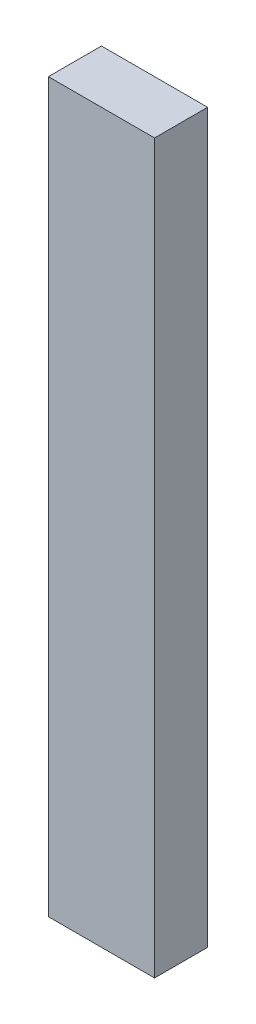
ISO-10303-21;
HEADER;
FILE_DESCRIPTION(('STEP AP214'),'2;1');
FILE_NAME('part.step','',(''),(''),'','','');
FILE_SCHEMA(('AUTOMOTIVE_DESIGN { 1 0 10303 214 1 1 1 1 }'));
ENDSEC;
DATA;
#1=APPLICATION_CONTEXT('core data for automotive mechanical design processes');
#2=APPLICATION_PROTOCOL_DEFINITION('international standard','automotive_design',2000,#1);
#3=PRODUCT_CONTEXT('',#1,'mechanical');
#4=PRODUCT('Part','Part','',(#3));
#5=PRODUCT_RELATED_PRODUCT_CATEGORY('part','',(#4));
#6=PRODUCT_DEFINITION_FORMATION('','',#4);
#7=PRODUCT_DEFINITION_CONTEXT('part definition',#1,'design');
#8=PRODUCT_DEFINITION('design','',#6,#7);
#9=PRODUCT_DEFINITION_SHAPE('','',#8);
#10=(LENGTH_UNIT() NAMED_UNIT(*) SI_UNIT(.MILLI.,.METRE.));
#11=(NAMED_UNIT(*) PLANE_ANGLE_UNIT() SI_UNIT($,.RADIAN.));
#12=(NAMED_UNIT(*) SI_UNIT($,.STERADIAN.) SOLID_ANGLE_UNIT());
#13=UNCERTAINTY_MEASURE_WITH_UNIT(LENGTH_MEASURE(1.E-05),#10,'distance_accuracy_value','');
#14=(GEOMETRIC_REPRESENTATION_CONTEXT(3) GLOBAL_UNCERTAINTY_ASSIGNED_CONTEXT((#13)) GLOBAL_UNIT_ASSIGNED_CONTEXT((#10,
#11,#12)) REPRESENTATION_CONTEXT('',''));
#15=CARTESIAN_POINT('',(0.,0.,0.));
#16=DIRECTION('',(0.,0.,1.));
#17=DIRECTION('',(1.,0.,0.));
#18=AXIS2_PLACEMENT_3D('',#15,#16,#17);
#19=CARTESIAN_POINT('',(304.8,4178.3,-152.4));
#20=DIRECTION('',(-1.,0.,0.));
#21=DIRECTION('',(0.,0.,1.));
#22=AXIS2_PLACEMENT_3D('',#19,#20,#21);
#23=PLANE('',#22);
#24=DIRECTION('',(0.,0.,-1.));
#25=VECTOR('',#24,1.);
#26=CARTESIAN_POINT('',(304.8,0.,-152.4));
#27=LINE('',#26,#25);
#28=CARTESIAN_POINT('',(304.8,0.,152.4));
#29=VERTEX_POINT('',#28);
#30=CARTESIAN_POINT('',(304.8,0.,-152.4));
#31=VERTEX_POINT('',#30);
#32=EDGE_CURVE('E117',#29,#31,#27,.T.);
#33=ORIENTED_EDGE('',*,*,#32,.T.);
#34=DIRECTION('',(0.,-1.,0.));
#35=VECTOR('',#34,1.);
#36=CARTESIAN_POINT('',(304.8,4178.3,-152.4));
#37=LINE('',#36,#35);
#38=CARTESIAN_POINT('',(304.8,4178.3,-152.4));
#39=VERTEX_POINT('',#38);
#40=EDGE_CURVE('E11',#39,#31,#37,.T.);
#41=ORIENTED_EDGE('',*,*,#40,.F.);
#42=DIRECTION('',(0.,0.,-1.));
#43=VECTOR('',#42,1.);
#44=CARTESIAN_POINT('',(304.8,4178.3,-152.4));
#45=LINE('',#44,#43);
#46=CARTESIAN_POINT('',(304.8,4178.3,152.4));
#47=VERTEX_POINT('',#46);
#48=EDGE_CURVE('E101',#47,#39,#45,.T.);
#49=ORIENTED_EDGE('',*,*,#48,.F.);
#50=DIRECTION('',(0.,-1.,0.));
#51=VECTOR('',#50,1.);
#52=CARTESIAN_POINT('',(304.8,4178.3,152.4));
#53=LINE('',#52,#51);
#54=EDGE_CURVE('E113',#47,#29,#53,.T.);
#55=ORIENTED_EDGE('',*,*,#54,.T.);
#56=EDGE_LOOP('',(#33,#41,#49,#55));
#57=FACE_BOUND('',#56,.T.);
#58=ADVANCED_FACE('F43',(#57),#23,.F.);
#59=CARTESIAN_POINT('',(-304.8,4178.3,-152.4));
#60=DIRECTION('',(0.,0.,1.));
#61=DIRECTION('',(1.,0.,0.));
#62=AXIS2_PLACEMENT_3D('',#59,#60,#61);
#63=PLANE('',#62);
#64=DIRECTION('',(-1.,0.,0.));
#65=VECTOR('',#64,1.);
#66=CARTESIAN_POINT('',(-304.8,0.,-152.4));
#67=LINE('',#66,#65);
#68=CARTESIAN_POINT('',(-304.8,0.,-152.4));
#69=VERTEX_POINT('',#68);
#70=EDGE_CURVE('E106',#31,#69,#67,.T.);
#71=ORIENTED_EDGE('',*,*,#70,.T.);
#72=DIRECTION('',(0.,-1.,0.));
#73=VECTOR('',#72,1.);
#74=CARTESIAN_POINT('',(-304.8,4178.3,-152.4));
#75=LINE('',#74,#73);
#76=CARTESIAN_POINT('',(-304.8,4178.3,-152.4));
#77=VERTEX_POINT('',#76);
#78=EDGE_CURVE('E52',#77,#69,#75,.T.);
#79=ORIENTED_EDGE('',*,*,#78,.F.);
#80=DIRECTION('',(-1.,0.,0.));
#81=VECTOR('',#80,1.);
#82=CARTESIAN_POINT('',(-304.8,4178.3,-152.4));
#83=LINE('',#82,#81);
#84=EDGE_CURVE('E95',#39,#77,#83,.T.);
#85=ORIENTED_EDGE('',*,*,#84,.F.);
#86=ORIENTED_EDGE('',*,*,#40,.T.);
#87=EDGE_LOOP('',(#71,#79,#85,#86));
#88=FACE_BOUND('',#87,.T.);
#89=ADVANCED_FACE('F105',(#88),#63,.F.);
#90=CARTESIAN_POINT('',(-304.8,4178.3,-152.4));
#91=DIRECTION('',(1.,0.,0.));
#92=DIRECTION('',(0.,0.,-1.));
#93=AXIS2_PLACEMENT_3D('',#90,#91,#92);
#94=PLANE('',#93);
#95=DIRECTION('',(0.,0.,1.));
#96=VECTOR('',#95,1.);
#97=CARTESIAN_POINT('',(-304.8,0.,-152.4));
#98=LINE('',#97,#96);
#99=CARTESIAN_POINT('',(-304.8,0.,152.4));
#100=VERTEX_POINT('',#99);
#101=EDGE_CURVE('E82',#69,#100,#98,.T.);
#102=ORIENTED_EDGE('',*,*,#101,.T.);
#103=DIRECTION('',(0.,-1.,0.));
#104=VECTOR('',#103,1.);
#105=CARTESIAN_POINT('',(-304.8,4178.3,152.4));
#106=LINE('',#105,#104);
#107=CARTESIAN_POINT('',(-304.8,4178.3,152.4));
#108=VERTEX_POINT('',#107);
#109=EDGE_CURVE('E108',#108,#100,#106,.T.);
#110=ORIENTED_EDGE('',*,*,#109,.F.);
#111=DIRECTION('',(0.,0.,1.));
#112=VECTOR('',#111,1.);
#113=CARTESIAN_POINT('',(-304.8,4178.3,-152.4));
#114=LINE('',#113,#112);
#115=EDGE_CURVE('E99',#77,#108,#114,.T.);
#116=ORIENTED_EDGE('',*,*,#115,.F.);
#117=ORIENTED_EDGE('',*,*,#78,.T.);
#118=EDGE_LOOP('',(#102,#110,#116,#117));
#119=FACE_BOUND('',#118,.T.);
#120=ADVANCED_FACE('F109',(#119),#94,.F.);
#121=CARTESIAN_POINT('',(-304.8,4178.3,152.4));
#122=DIRECTION('',(0.,0.,-1.));
#123=DIRECTION('',(-1.,0.,0.));
#124=AXIS2_PLACEMENT_3D('',#121,#122,#123);
#125=PLANE('',#124);
#126=DIRECTION('',(1.,0.,0.));
#127=VECTOR('',#126,1.);
#128=CARTESIAN_POINT('',(-304.8,0.,152.4));
#129=LINE('',#128,#127);
#130=EDGE_CURVE('E88',#100,#29,#129,.T.);
#131=ORIENTED_EDGE('',*,*,#130,.T.);
#132=ORIENTED_EDGE('',*,*,#54,.F.);
#133=DIRECTION('',(1.,0.,0.));
#134=VECTOR('',#133,1.);
#135=CARTESIAN_POINT('',(-304.8,4178.3,152.4));
#136=LINE('',#135,#134);
#137=EDGE_CURVE('E62',#108,#47,#136,.T.);
#138=ORIENTED_EDGE('',*,*,#137,.F.);
#139=ORIENTED_EDGE('',*,*,#109,.T.);
#140=EDGE_LOOP('',(#131,#132,#138,#139));
#141=FACE_BOUND('',#140,.T.);
#142=ADVANCED_FACE('F129',(#141),#125,.F.);
#143=CARTESIAN_POINT('',(0.,4178.3,0.));
#144=DIRECTION('',(0.,1.,0.));
#145=DIRECTION('',(0.,0.,1.));
#146=AXIS2_PLACEMENT_3D('',#143,#144,#145);
#147=PLANE('',#146);
#148=ORIENTED_EDGE('',*,*,#48,.T.);
#149=ORIENTED_EDGE('',*,*,#84,.T.);
#150=ORIENTED_EDGE('',*,*,#115,.T.);
#151=ORIENTED_EDGE('',*,*,#137,.T.);
#152=EDGE_LOOP('',(#148,#149,#150,#151));
#153=FACE_BOUND('',#152,.T.);
#154=ADVANCED_FACE('F97',(#153),#147,.T.);
#155=CARTESIAN_POINT('',(0.,0.,0.));
#156=DIRECTION('',(0.,1.,0.));
#157=DIRECTION('',(0.,0.,1.));
#158=AXIS2_PLACEMENT_3D('',#155,#156,#157);
#159=PLANE('',#158);
#160=ORIENTED_EDGE('',*,*,#32,.F.);
#161=ORIENTED_EDGE('',*,*,#130,.F.);
#162=ORIENTED_EDGE('',*,*,#101,.F.);
#163=ORIENTED_EDGE('',*,*,#70,.F.);
#164=EDGE_LOOP('',(#160,#161,#162,#163));
#165=FACE_BOUND('',#164,.T.);
#166=ADVANCED_FACE('F132',(#165),#159,.F.);
#167=CLOSED_SHELL('',(#58,#89,#120,#142,#154,#166));
#168=MANIFOLD_SOLID_BREP('B2',#167);
#169=ADVANCED_BREP_SHAPE_REPRESENTATION('',(#18,#168),#14);
#170=SHAPE_DEFINITION_REPRESENTATION(#9,#169);
ENDSEC;
END-ISO-10303-21;
